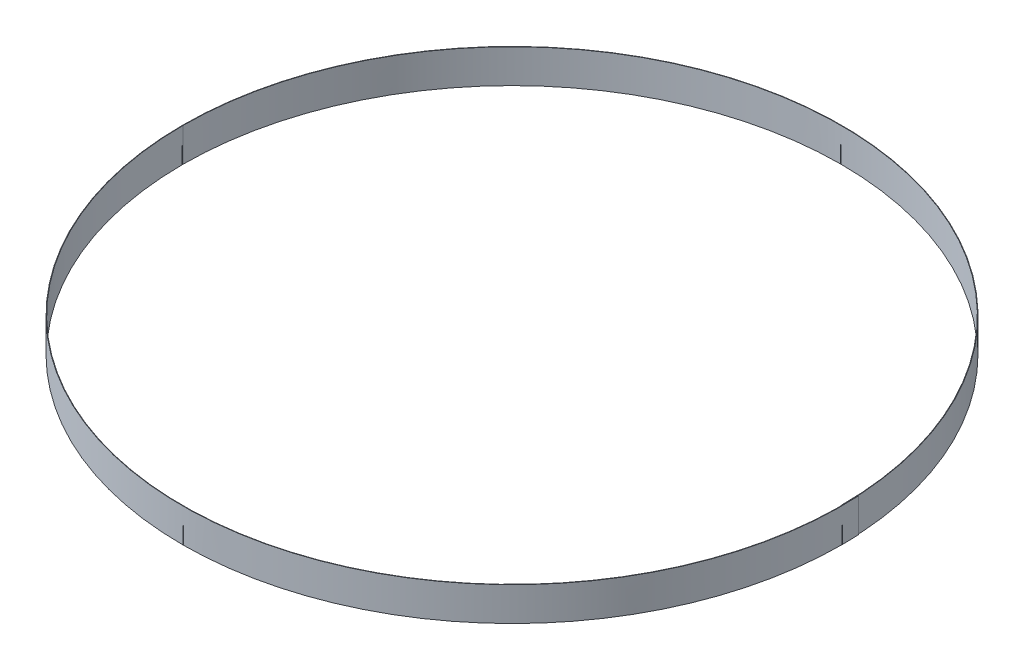
ISO-10303-21;
HEADER;
FILE_DESCRIPTION(('STEP AP214'),'2;1');
FILE_NAME('part.step','',(''),(''),'','','');
FILE_SCHEMA(('AUTOMOTIVE_DESIGN { 1 0 10303 214 1 1 1 1 }'));
ENDSEC;
DATA;
#1=APPLICATION_CONTEXT('core data for automotive mechanical design processes');
#2=APPLICATION_PROTOCOL_DEFINITION('international standard','automotive_design',2000,#1);
#3=PRODUCT_CONTEXT('',#1,'mechanical');
#4=PRODUCT('Part','Part','',(#3));
#5=PRODUCT_RELATED_PRODUCT_CATEGORY('part','',(#4));
#6=PRODUCT_DEFINITION_FORMATION('','',#4);
#7=PRODUCT_DEFINITION_CONTEXT('part definition',#1,'design');
#8=PRODUCT_DEFINITION('design','',#6,#7);
#9=PRODUCT_DEFINITION_SHAPE('','',#8);
#10=(LENGTH_UNIT() NAMED_UNIT(*) SI_UNIT(.MILLI.,.METRE.));
#11=(NAMED_UNIT(*) PLANE_ANGLE_UNIT() SI_UNIT($,.RADIAN.));
#12=(NAMED_UNIT(*) SI_UNIT($,.STERADIAN.) SOLID_ANGLE_UNIT());
#13=UNCERTAINTY_MEASURE_WITH_UNIT(LENGTH_MEASURE(1.E-05),#10,'distance_accuracy_value','');
#14=(GEOMETRIC_REPRESENTATION_CONTEXT(3) GLOBAL_UNCERTAINTY_ASSIGNED_CONTEXT((#13)) GLOBAL_UNIT_ASSIGNED_CONTEXT((#10,
#11,#12)) REPRESENTATION_CONTEXT('',''));
#15=CARTESIAN_POINT('',(0.,0.,0.));
#16=DIRECTION('',(0.,0.,1.));
#17=DIRECTION('',(1.,0.,0.));
#18=AXIS2_PLACEMENT_3D('',#15,#16,#17);
#19=CARTESIAN_POINT('',(195.5,15.,0.));
#20=DIRECTION('',(0.,0.,-1.));
#21=DIRECTION('',(0.,1.,0.));
#22=AXIS2_PLACEMENT_3D('',#19,#20,#21);
#23=PLANE('',#22);
#24=DIRECTION('',(-1.,0.,0.));
#25=VECTOR('',#24,1.);
#26=CARTESIAN_POINT('',(195.5,10.,0.));
#27=LINE('',#26,#25);
#28=CARTESIAN_POINT('',(195.75,10.,0.));
#29=VERTEX_POINT('',#28);
#30=CARTESIAN_POINT('',(195.5,10.,0.));
#31=VERTEX_POINT('',#30);
#32=EDGE_CURVE('E111',#29,#31,#27,.T.);
#33=ORIENTED_EDGE('',*,*,#32,.F.);
#34=DIRECTION('',(0.,-1.,0.));
#35=VECTOR('',#34,1.);
#36=CARTESIAN_POINT('',(195.75,629.899456202727,0.));
#37=LINE('',#36,#35);
#38=CARTESIAN_POINT('',(195.75,20.,0.));
#39=VERTEX_POINT('',#38);
#40=EDGE_CURVE('E310',#29,#39,#37,.F.);
#41=ORIENTED_EDGE('',*,*,#40,.T.);
#42=DIRECTION('',(-1.,0.,0.));
#43=VECTOR('',#42,1.);
#44=CARTESIAN_POINT('',(195.5,20.,0.));
#45=LINE('',#44,#43);
#46=CARTESIAN_POINT('',(195.5,20.,0.));
#47=VERTEX_POINT('',#46);
#48=EDGE_CURVE('E61',#39,#47,#45,.T.);
#49=ORIENTED_EDGE('',*,*,#48,.T.);
#50=DIRECTION('',(0.,1.,0.));
#51=VECTOR('',#50,1.);
#52=CARTESIAN_POINT('',(195.5,10.,0.));
#53=LINE('',#52,#51);
#54=EDGE_CURVE('E260',#31,#47,#53,.T.);
#55=ORIENTED_EDGE('',*,*,#54,.F.);
#56=EDGE_LOOP('',(#33,#41,#49,#55));
#57=FACE_BOUND('',#56,.T.);
#58=ADVANCED_FACE('F42',(#57),#23,.F.);
#59=CARTESIAN_POINT('',(0.,10.,0.));
#60=DIRECTION('',(0.,1.,0.));
#61=DIRECTION('',(0.,0.,1.));
#62=AXIS2_PLACEMENT_3D('',#59,#60,#61);
#63=PLANE('',#62);
#64=DIRECTION('',(-0.999998824118064,0.,0.00153354572478864));
#65=VECTOR('',#64,1.);
#66=CARTESIAN_POINT('',(195.499770115081,10.,-0.299808189196199));
#67=LINE('',#66,#65);
#68=CARTESIAN_POINT('',(195.749769821111,10.,-0.300191575627417));
#69=VERTEX_POINT('',#68);
#70=CARTESIAN_POINT('',(195.499770115081,10.,-0.299808189196199));
#71=VERTEX_POINT('',#70);
#72=EDGE_CURVE('E301',#69,#71,#67,.T.);
#73=ORIENTED_EDGE('',*,*,#72,.F.);
#74=CARTESIAN_POINT('',(0.,10.,0.));
#75=DIRECTION('',(0.,-1.,0.));
#76=DIRECTION('',(0.,0.,-1.));
#77=AXIS2_PLACEMENT_3D('',#74,#75,#76);
#78=CIRCLE('',#77,195.75);
#79=EDGE_CURVE('E307',#69,#29,#78,.T.);
#80=ORIENTED_EDGE('',*,*,#79,.T.);
#81=ORIENTED_EDGE('',*,*,#32,.T.);
#82=CARTESIAN_POINT('',(0.,10.,0.));
#83=DIRECTION('',(0.,-1.,0.));
#84=DIRECTION('',(0.,0.,-1.));
#85=AXIS2_PLACEMENT_3D('',#82,#83,#84);
#86=CIRCLE('',#85,195.5);
#87=EDGE_CURVE('E263',#71,#31,#86,.T.);
#88=ORIENTED_EDGE('',*,*,#87,.F.);
#89=EDGE_LOOP('',(#73,#80,#81,#88));
#90=FACE_BOUND('',#89,.T.);
#91=ADVANCED_FACE('F478',(#90),#63,.F.);
#92=CARTESIAN_POINT('',(195.499770115081,5.,-0.299808189196201));
#93=DIRECTION('',(-0.00153354572478865,0.,-0.999998824118064));
#94=DIRECTION('',(0.,1.,0.));
#95=AXIS2_PLACEMENT_3D('',#92,#93,#94);
#96=PLANE('',#95);
#97=DIRECTION('',(-0.999998824118064,0.,0.00153354572478919));
#98=VECTOR('',#97,1.);
#99=CARTESIAN_POINT('',(195.499770115081,0.,-0.299808189196307));
#100=LINE('',#99,#98);
#101=CARTESIAN_POINT('',(195.749769821111,0.,-0.300191575627417));
#102=VERTEX_POINT('',#101);
#103=CARTESIAN_POINT('',(195.499770115081,0.,-0.299808189196307));
#104=VERTEX_POINT('',#103);
#105=EDGE_CURVE('E296',#102,#104,#100,.T.);
#106=ORIENTED_EDGE('',*,*,#105,.F.);
#107=DIRECTION('',(0.,-1.,0.));
#108=VECTOR('',#107,1.);
#109=CARTESIAN_POINT('',(195.749769821111,629.899456202727,-0.300191575627417));
#110=LINE('',#109,#108);
#111=EDGE_CURVE('E303',#102,#69,#110,.F.);
#112=ORIENTED_EDGE('',*,*,#111,.T.);
#113=ORIENTED_EDGE('',*,*,#72,.T.);
#114=DIRECTION('',(0.,1.,0.));
#115=VECTOR('',#114,1.);
#116=CARTESIAN_POINT('',(195.499770115081,0.,-0.299808189196203));
#117=LINE('',#116,#115);
#118=EDGE_CURVE('E266',#104,#71,#117,.T.);
#119=ORIENTED_EDGE('',*,*,#118,.F.);
#120=EDGE_LOOP('',(#106,#112,#113,#119));
#121=FACE_BOUND('',#120,.T.);
#122=ADVANCED_FACE('F483',(#121),#96,.F.);
#123=CARTESIAN_POINT('',(0.,0.,0.));
#124=DIRECTION('',(0.,1.,0.));
#125=DIRECTION('',(0.,0.,1.));
#126=AXIS2_PLACEMENT_3D('',#123,#124,#125);
#127=PLANE('',#126);
#128=DIRECTION('',(0.00052942397909441,0.,0.999999859855115));
#129=VECTOR('',#128,1.);
#130=CARTESIAN_POINT('',(-0.103502387912957,0.,-195.499972601675));
#131=LINE('',#130,#129);
#132=CARTESIAN_POINT('',(-0.103634743907704,0.,-195.749972566639));
#133=VERTEX_POINT('',#132);
#134=CARTESIAN_POINT('',(-0.103502387912957,0.,-195.499972601675));
#135=VERTEX_POINT('',#134);
#136=EDGE_CURVE('E291',#133,#135,#131,.T.);
#137=ORIENTED_EDGE('',*,*,#136,.F.);
#138=CARTESIAN_POINT('',(0.,0.,0.));
#139=DIRECTION('',(0.,-1.,0.));
#140=DIRECTION('',(0.,0.,-1.));
#141=AXIS2_PLACEMENT_3D('',#138,#139,#140);
#142=CIRCLE('',#141,195.75);
#143=EDGE_CURVE('E298',#133,#102,#142,.T.);
#144=ORIENTED_EDGE('',*,*,#143,.T.);
#145=ORIENTED_EDGE('',*,*,#105,.T.);
#146=CARTESIAN_POINT('',(0.,0.,0.));
#147=DIRECTION('',(0.,-1.,0.));
#148=DIRECTION('',(0.,0.,-1.));
#149=AXIS2_PLACEMENT_3D('',#146,#147,#148);
#150=CIRCLE('',#149,195.5);
#151=EDGE_CURVE('E269',#135,#104,#150,.T.);
#152=ORIENTED_EDGE('',*,*,#151,.F.);
#153=EDGE_LOOP('',(#137,#144,#145,#152));
#154=FACE_BOUND('',#153,.T.);
#155=ADVANCED_FACE('F490',(#154),#127,.F.);
#156=CARTESIAN_POINT('',(-0.103502387912957,5.,-195.499972601675));
#157=DIRECTION('',(0.999999859855115,0.,-0.00052942397909441));
#158=DIRECTION('',(0.,-1.,0.));
#159=AXIS2_PLACEMENT_3D('',#156,#157,#158);
#160=PLANE('',#159);
#161=DIRECTION('',(0.00052942397909441,0.,0.999999859855115));
#162=VECTOR('',#161,1.);
#163=CARTESIAN_POINT('',(-0.103502387912957,10.,-195.499972601675));
#164=LINE('',#163,#162);
#165=CARTESIAN_POINT('',(-0.103634743907704,10.,-195.749972566639));
#166=VERTEX_POINT('',#165);
#167=CARTESIAN_POINT('',(-0.103502387912957,10.,-195.499972601675));
#168=VERTEX_POINT('',#167);
#169=EDGE_CURVE('E286',#166,#168,#164,.T.);
#170=ORIENTED_EDGE('',*,*,#169,.F.);
#171=DIRECTION('',(0.,-1.,0.));
#172=VECTOR('',#171,1.);
#173=CARTESIAN_POINT('',(-0.103634743907704,629.899456202727,-195.749972566639));
#174=LINE('',#173,#172);
#175=EDGE_CURVE('E293',#166,#133,#174,.T.);
#176=ORIENTED_EDGE('',*,*,#175,.T.);
#177=ORIENTED_EDGE('',*,*,#136,.T.);
#178=DIRECTION('',(0.,-1.,0.));
#179=VECTOR('',#178,1.);
#180=CARTESIAN_POINT('',(-0.103502387912957,10.,-195.499972601675));
#181=LINE('',#180,#179);
#182=EDGE_CURVE('E272',#168,#135,#181,.T.);
#183=ORIENTED_EDGE('',*,*,#182,.F.);
#184=EDGE_LOOP('',(#170,#176,#177,#183));
#185=FACE_BOUND('',#184,.T.);
#186=ADVANCED_FACE('F494',(#185),#160,.F.);
#187=CARTESIAN_POINT('',(0.,10.,0.));
#188=DIRECTION('',(0.,1.,0.));
#189=DIRECTION('',(0.,0.,1.));
#190=AXIS2_PLACEMENT_3D('',#187,#188,#189);
#191=PLANE('',#190);
#192=CARTESIAN_POINT('',(0.,10.,0.));
#193=DIRECTION('',(0.,-1.,0.));
#194=DIRECTION('',(0.,0.,-1.));
#195=AXIS2_PLACEMENT_3D('',#192,#193,#194);
#196=CIRCLE('',#195,195.75);
#197=CARTESIAN_POINT('',(-0.40382615560264,10.,-195.749583459164));
#198=VERTEX_POINT('',#197);
#199=EDGE_CURVE('E288',#198,#166,#196,.T.);
#200=ORIENTED_EDGE('',*,*,#199,.T.);
#201=ORIENTED_EDGE('',*,*,#169,.T.);
#202=CARTESIAN_POINT('',(0.,10.,0.));
#203=DIRECTION('',(0.,-1.,0.));
#204=DIRECTION('',(0.,0.,-1.));
#205=AXIS2_PLACEMENT_3D('',#202,#203,#204);
#206=CIRCLE('',#205,195.5);
#207=CARTESIAN_POINT('',(-0.40331041338601,10.,-195.499583991144));
#208=VERTEX_POINT('',#207);
#209=EDGE_CURVE('E275',#208,#168,#206,.T.);
#210=ORIENTED_EDGE('',*,*,#209,.F.);
#211=DIRECTION('',(0.0020629688664246,0.,0.999997872077464));
#212=VECTOR('',#211,1.);
#213=CARTESIAN_POINT('',(-0.40331041338601,10.,-195.499583991144));
#214=LINE('',#213,#212);
#215=EDGE_CURVE('E281',#198,#208,#214,.T.);
#216=ORIENTED_EDGE('',*,*,#215,.F.);
#217=EDGE_LOOP('',(#200,#201,#210,#216));
#218=FACE_BOUND('',#217,.T.);
#219=ADVANCED_FACE('F498',(#218),#191,.F.);
#220=CARTESIAN_POINT('',(-0.40331041338601,5.,-195.499583991144));
#221=DIRECTION('',(-0.999997872077464,0.,0.0020629688664246));
#222=DIRECTION('',(0.,1.,0.));
#223=AXIS2_PLACEMENT_3D('',#220,#221,#222);
#224=PLANE('',#223);
#225=DIRECTION('',(0.00206296886642472,0.,0.999997872077464));
#226=VECTOR('',#225,1.);
#227=CARTESIAN_POINT('',(-0.403310413386034,0.,-195.499583991144));
#228=LINE('',#227,#226);
#229=CARTESIAN_POINT('',(-0.40382615560264,0.,-195.749583459164));
#230=VERTEX_POINT('',#229);
#231=CARTESIAN_POINT('',(-0.403310413386034,0.,-195.499583991144));
#232=VERTEX_POINT('',#231);
#233=EDGE_CURVE('E243',#230,#232,#228,.T.);
#234=ORIENTED_EDGE('',*,*,#233,.F.);
#235=DIRECTION('',(0.,-1.,0.));
#236=VECTOR('',#235,1.);
#237=CARTESIAN_POINT('',(-0.40382615560264,629.899456202727,-195.749583459164));
#238=LINE('',#237,#236);
#239=EDGE_CURVE('E283',#230,#198,#238,.F.);
#240=ORIENTED_EDGE('',*,*,#239,.T.);
#241=ORIENTED_EDGE('',*,*,#215,.T.);
#242=DIRECTION('',(0.,1.,0.));
#243=VECTOR('',#242,1.);
#244=CARTESIAN_POINT('',(-0.40331041338601,0.,-195.499583991144));
#245=LINE('',#244,#243);
#246=EDGE_CURVE('E278',#232,#208,#245,.T.);
#247=ORIENTED_EDGE('',*,*,#246,.F.);
#248=EDGE_LOOP('',(#234,#240,#241,#247));
#249=FACE_BOUND('',#248,.T.);
#250=ADVANCED_FACE('F502',(#249),#224,.F.);
#251=CARTESIAN_POINT('',(0.,629.899456202727,0.));
#252=DIRECTION('',(0.,-1.,0.));
#253=DIRECTION('',(0.,0.,-1.));
#254=AXIS2_PLACEMENT_3D('',#251,#252,#253);
#255=CYLINDRICAL_SURFACE('',#254,195.5);
#256=ORIENTED_EDGE('',*,*,#246,.T.);
#257=ORIENTED_EDGE('',*,*,#209,.T.);
#258=ORIENTED_EDGE('',*,*,#182,.T.);
#259=ORIENTED_EDGE('',*,*,#151,.T.);
#260=ORIENTED_EDGE('',*,*,#118,.T.);
#261=ORIENTED_EDGE('',*,*,#87,.T.);
#262=ORIENTED_EDGE('',*,*,#54,.T.);
#263=CARTESIAN_POINT('',(0.,20.,0.));
#264=DIRECTION('',(0.,1.,0.));
#265=DIRECTION('',(0.,0.,1.));
#266=AXIS2_PLACEMENT_3D('',#263,#264,#265);
#267=CIRCLE('',#266,195.5);
#268=CARTESIAN_POINT('',(-195.5,20.,1.33188619175765E-12));
#269=VERTEX_POINT('',#268);
#270=EDGE_CURVE('E257',#47,#269,#267,.T.);
#271=ORIENTED_EDGE('',*,*,#270,.T.);
#272=DIRECTION('',(0.,-1.,0.));
#273=VECTOR('',#272,1.);
#274=CARTESIAN_POINT('',(-195.5,20.,-2.99760216648792E-12));
#275=LINE('',#274,#273);
#276=CARTESIAN_POINT('',(-195.5,0.,-1.51624929592019E-12));
#277=VERTEX_POINT('',#276);
#278=EDGE_CURVE('E254',#269,#277,#275,.T.);
#279=ORIENTED_EDGE('',*,*,#278,.T.);
#280=CARTESIAN_POINT('',(0.,0.,0.));
#281=DIRECTION('',(0.,-1.,0.));
#282=DIRECTION('',(0.,0.,-1.));
#283=AXIS2_PLACEMENT_3D('',#280,#281,#282);
#284=CIRCLE('',#283,195.5);
#285=EDGE_CURVE('E251',#277,#232,#284,.T.);
#286=ORIENTED_EDGE('',*,*,#285,.T.);
#287=EDGE_LOOP('',(#256,#257,#258,#259,#260,#261,#262,#271,#279,#286));
#288=FACE_BOUND('',#287,.T.);
#289=ADVANCED_FACE('F339',(#288),#255,.F.);
#290=CARTESIAN_POINT('',(0.,0.,0.));
#291=DIRECTION('',(0.,1.,0.));
#292=DIRECTION('',(0.,0.,1.));
#293=AXIS2_PLACEMENT_3D('',#290,#291,#292);
#294=PLANE('',#293);
#295=DIRECTION('',(-1.,0.,-1.75138387043877E-13));
#296=VECTOR('',#295,1.);
#297=CARTESIAN_POINT('',(-195.5,0.,-2.99760216648792E-12));
#298=LINE('',#297,#296);
#299=CARTESIAN_POINT('',(-195.75,0.,-3.10862446895044E-12));
#300=VERTEX_POINT('',#299);
#301=EDGE_CURVE('E248',#277,#300,#298,.T.);
#302=ORIENTED_EDGE('',*,*,#301,.T.);
#303=CARTESIAN_POINT('',(0.,0.,0.));
#304=DIRECTION('',(0.,-1.,0.));
#305=DIRECTION('',(0.,0.,-1.));
#306=AXIS2_PLACEMENT_3D('',#303,#304,#305);
#307=CIRCLE('',#306,195.75);
#308=EDGE_CURVE('E245',#300,#230,#307,.T.);
#309=ORIENTED_EDGE('',*,*,#308,.T.);
#310=ORIENTED_EDGE('',*,*,#233,.T.);
#311=ORIENTED_EDGE('',*,*,#285,.F.);
#312=EDGE_LOOP('',(#302,#309,#310,#311));
#313=FACE_BOUND('',#312,.T.);
#314=ADVANCED_FACE('F323',(#313),#294,.F.);
#315=CARTESIAN_POINT('',(0.,629.899456202727,0.));
#316=DIRECTION('',(0.,-1.,0.));
#317=DIRECTION('',(0.,0.,-1.));
#318=AXIS2_PLACEMENT_3D('',#315,#316,#317);
#319=CYLINDRICAL_SURFACE('',#318,195.75);
#320=ORIENTED_EDGE('',*,*,#239,.F.);
#321=ORIENTED_EDGE('',*,*,#308,.F.);
#322=DIRECTION('',(0.,-1.,0.));
#323=VECTOR('',#322,1.);
#324=CARTESIAN_POINT('',(-195.75,20.,-3.10862446895044E-12));
#325=LINE('',#324,#323);
#326=CARTESIAN_POINT('',(-195.75,20.,-1.22649684092107E-13));
#327=VERTEX_POINT('',#326);
#328=EDGE_CURVE('E46',#327,#300,#325,.T.);
#329=ORIENTED_EDGE('',*,*,#328,.F.);
#330=CARTESIAN_POINT('',(0.,20.,0.));
#331=DIRECTION('',(0.,-1.,0.));
#332=DIRECTION('',(0.,0.,-1.));
#333=AXIS2_PLACEMENT_3D('',#330,#331,#332);
#334=CIRCLE('',#333,195.75);
#335=EDGE_CURVE('E52',#39,#327,#334,.F.);
#336=ORIENTED_EDGE('',*,*,#335,.F.);
#337=ORIENTED_EDGE('',*,*,#40,.F.);
#338=ORIENTED_EDGE('',*,*,#79,.F.);
#339=ORIENTED_EDGE('',*,*,#111,.F.);
#340=ORIENTED_EDGE('',*,*,#143,.F.);
#341=ORIENTED_EDGE('',*,*,#175,.F.);
#342=ORIENTED_EDGE('',*,*,#199,.F.);
#343=EDGE_LOOP('',(#320,#321,#329,#336,#337,#338,#339,#340,#341,#342));
#344=FACE_BOUND('',#343,.T.);
#345=ADVANCED_FACE('F319',(#344),#319,.T.);
#346=CARTESIAN_POINT('',(0.,20.,0.));
#347=DIRECTION('',(0.,-1.,0.));
#348=DIRECTION('',(0.,0.,-1.));
#349=AXIS2_PLACEMENT_3D('',#346,#347,#348);
#350=PLANE('',#349);
#351=ORIENTED_EDGE('',*,*,#48,.F.);
#352=ORIENTED_EDGE('',*,*,#335,.T.);
#353=DIRECTION('',(1.,0.,1.75138387043877E-13));
#354=VECTOR('',#353,1.);
#355=CARTESIAN_POINT('',(-195.75,20.,-3.10862446895044E-12));
#356=LINE('',#355,#354);
#357=EDGE_CURVE('E11',#327,#269,#356,.T.);
#358=ORIENTED_EDGE('',*,*,#357,.T.);
#359=ORIENTED_EDGE('',*,*,#270,.F.);
#360=EDGE_LOOP('',(#351,#352,#358,#359));
#361=FACE_BOUND('',#360,.T.);
#362=ADVANCED_FACE('F44',(#361),#350,.F.);
#363=CARTESIAN_POINT('',(-195.499890476784,5.,0.207004831546077));
#364=DIRECTION('',(-0.0010581703328762,0.,-0.999999440137617));
#365=DIRECTION('',(0.,-1.,0.));
#366=AXIS2_PLACEMENT_3D('',#363,#364,#365);
#367=PLANE('',#366);
#368=DIRECTION('',(0.999999440137617,0.,-0.0010581703328762));
#369=VECTOR('',#368,1.);
#370=CARTESIAN_POINT('',(-195.499890476784,10.,0.207004831546077));
#371=LINE('',#370,#369);
#372=CARTESIAN_POINT('',(-195.749890336818,10.,0.207269374129356));
#373=VERTEX_POINT('',#372);
#374=CARTESIAN_POINT('',(-195.499890476784,10.,0.207004831546077));
#375=VERTEX_POINT('',#374);
#376=EDGE_CURVE('E178',#373,#375,#371,.T.);
#377=ORIENTED_EDGE('',*,*,#376,.F.);
#378=DIRECTION('',(0.,-1.,0.));
#379=VECTOR('',#378,1.);
#380=CARTESIAN_POINT('',(-195.749890336818,635.311089282251,0.207269374129356));
#381=LINE('',#380,#379);
#382=CARTESIAN_POINT('',(-195.749890336818,0.,0.207269374129356));
#383=VERTEX_POINT('',#382);
#384=EDGE_CURVE('E182',#373,#383,#381,.T.);
#385=ORIENTED_EDGE('',*,*,#384,.T.);
#386=DIRECTION('',(0.999999440137617,0.,-0.0010581703328762));
#387=VECTOR('',#386,1.);
#388=CARTESIAN_POINT('',(-195.499890476784,0.,0.207004831546077));
#389=LINE('',#388,#387);
#390=CARTESIAN_POINT('',(-195.499890476784,0.,0.207004831546077));
#391=VERTEX_POINT('',#390);
#392=EDGE_CURVE('E190',#383,#391,#389,.T.);
#393=ORIENTED_EDGE('',*,*,#392,.T.);
#394=DIRECTION('',(0.,-1.,0.));
#395=VECTOR('',#394,1.);
#396=CARTESIAN_POINT('',(-195.499890476784,10.,0.207004831546077));
#397=LINE('',#396,#395);
#398=EDGE_CURVE('E185',#375,#391,#397,.T.);
#399=ORIENTED_EDGE('',*,*,#398,.F.);
#400=EDGE_LOOP('',(#377,#385,#393,#399));
#401=FACE_BOUND('',#400,.T.);
#402=ADVANCED_FACE('F180',(#401),#367,.F.);
#403=CARTESIAN_POINT('',(0.125245877345664,0.,-2.94218604449392E-12));
#404=DIRECTION('',(0.,1.,0.));
#405=DIRECTION('',(0.,0.,1.));
#406=AXIS2_PLACEMENT_3D('',#403,#404,#405);
#407=PLANE('',#406);
#408=ORIENTED_EDGE('',*,*,#392,.F.);
#409=CARTESIAN_POINT('',(0.125245877345664,0.,-2.94218604449392E-12));
#410=DIRECTION('',(0.,-1.,0.));
#411=DIRECTION('',(0.,0.,-1.));
#412=AXIS2_PLACEMENT_3D('',#409,#410,#411);
#413=CIRCLE('',#412,195.875245877346);
#414=EDGE_CURVE('E119',#383,#300,#413,.T.);
#415=ORIENTED_EDGE('',*,*,#414,.T.);
#416=ORIENTED_EDGE('',*,*,#301,.F.);
#417=CARTESIAN_POINT('',(0.125245877345664,0.,-2.94218604449392E-12));
#418=DIRECTION('',(0.,-1.,0.));
#419=DIRECTION('',(0.,0.,-1.));
#420=AXIS2_PLACEMENT_3D('',#417,#418,#419);
#421=CIRCLE('',#420,195.625245877346);
#422=EDGE_CURVE('E201',#391,#277,#421,.T.);
#423=ORIENTED_EDGE('',*,*,#422,.F.);
#424=EDGE_LOOP('',(#408,#415,#416,#423));
#425=FACE_BOUND('',#424,.T.);
#426=ADVANCED_FACE('F327',(#425),#407,.F.);
#427=CARTESIAN_POINT('',(0.125245877345664,20.,-2.94218604449392E-12));
#428=DIRECTION('',(0.,-1.,0.));
#429=DIRECTION('',(0.,0.,-1.));
#430=AXIS2_PLACEMENT_3D('',#427,#428,#429);
#431=PLANE('',#430);
#432=ORIENTED_EDGE('',*,*,#357,.F.);
#433=CARTESIAN_POINT('',(0.125245877345664,20.,-2.94218604449392E-12));
#434=DIRECTION('',(0.,-1.,0.));
#435=DIRECTION('',(0.,0.,-1.));
#436=AXIS2_PLACEMENT_3D('',#433,#434,#435);
#437=CIRCLE('',#436,195.875245877346);
#438=CARTESIAN_POINT('',(195.743750330308,20.,-10.0256003858716));
#439=VERTEX_POINT('',#438);
#440=EDGE_CURVE('E316',#327,#439,#437,.F.);
#441=ORIENTED_EDGE('',*,*,#440,.T.);
#442=DIRECTION('',(-0.998689260487032,0.,0.0511836007708018));
#443=VECTOR('',#442,1.);
#444=CARTESIAN_POINT('',(195.494078015186,20.,-10.0128044856789));
#445=LINE('',#444,#443);
#446=CARTESIAN_POINT('',(195.494078015186,20.,-10.0128044856789));
#447=VERTEX_POINT('',#446);
#448=EDGE_CURVE('E236',#439,#447,#445,.T.);
#449=ORIENTED_EDGE('',*,*,#448,.T.);
#450=CARTESIAN_POINT('',(0.125245877345664,20.,-2.94218604449392E-12));
#451=DIRECTION('',(0.,1.,0.));
#452=DIRECTION('',(0.,0.,1.));
#453=AXIS2_PLACEMENT_3D('',#450,#451,#452);
#454=CIRCLE('',#453,195.625245877346);
#455=EDGE_CURVE('E336',#269,#447,#454,.T.);
#456=ORIENTED_EDGE('',*,*,#455,.F.);
#457=EDGE_LOOP('',(#432,#441,#449,#456));
#458=FACE_BOUND('',#457,.T.);
#459=ADVANCED_FACE('F344',(#458),#431,.F.);
#460=CARTESIAN_POINT('',(195.494078015186,10.,-10.0128044856789));
#461=DIRECTION('',(0.0511836007708016,0.,0.998689260487032));
#462=DIRECTION('',(0.,-1.,0.));
#463=AXIS2_PLACEMENT_3D('',#460,#461,#462);
#464=PLANE('',#463);
#465=ORIENTED_EDGE('',*,*,#448,.F.);
#466=DIRECTION('',(0.,-1.,0.));
#467=VECTOR('',#466,1.);
#468=CARTESIAN_POINT('',(195.743750330308,635.311089282251,-10.0256003858716));
#469=LINE('',#468,#467);
#470=CARTESIAN_POINT('',(195.743750330308,0.,-10.0256003858716));
#471=VERTEX_POINT('',#470);
#472=EDGE_CURVE('E407',#439,#471,#469,.T.);
#473=ORIENTED_EDGE('',*,*,#472,.T.);
#474=DIRECTION('',(-0.998689260487032,0.,0.0511836007708016));
#475=VECTOR('',#474,1.);
#476=CARTESIAN_POINT('',(195.494078015186,0.,-10.0128044856789));
#477=LINE('',#476,#475);
#478=CARTESIAN_POINT('',(195.494078015186,0.,-10.0128044856789));
#479=VERTEX_POINT('',#478);
#480=EDGE_CURVE('E233',#471,#479,#477,.T.);
#481=ORIENTED_EDGE('',*,*,#480,.T.);
#482=DIRECTION('',(0.,-1.,0.));
#483=VECTOR('',#482,1.);
#484=CARTESIAN_POINT('',(195.494078015186,20.,-10.0128044856789));
#485=LINE('',#484,#483);
#486=EDGE_CURVE('E347',#447,#479,#485,.T.);
#487=ORIENTED_EDGE('',*,*,#486,.F.);
#488=EDGE_LOOP('',(#465,#473,#481,#487));
#489=FACE_BOUND('',#488,.T.);
#490=ADVANCED_FACE('F411',(#489),#464,.F.);
#491=CARTESIAN_POINT('',(0.125245877345664,0.,-2.94218604449392E-12));
#492=DIRECTION('',(0.,1.,0.));
#493=DIRECTION('',(0.,0.,1.));
#494=AXIS2_PLACEMENT_3D('',#491,#492,#493);
#495=PLANE('',#494);
#496=ORIENTED_EDGE('',*,*,#480,.F.);
#497=CARTESIAN_POINT('',(0.125245877345664,0.,-2.94218604449392E-12));
#498=DIRECTION('',(0.,-1.,0.));
#499=DIRECTION('',(0.,0.,-1.));
#500=AXIS2_PLACEMENT_3D('',#497,#498,#499);
#501=CIRCLE('',#500,195.875245877346);
#502=CARTESIAN_POINT('',(196.000228715169,0.,-0.321007465769835));
#503=VERTEX_POINT('',#502);
#504=EDGE_CURVE('E404',#471,#503,#501,.T.);
#505=ORIENTED_EDGE('',*,*,#504,.T.);
#506=DIRECTION('',(-0.999998657106868,0.,0.00163883631302703));
#507=VECTOR('',#506,1.);
#508=CARTESIAN_POINT('',(195.750229050892,0.,-0.320597756691579));
#509=LINE('',#508,#507);
#510=CARTESIAN_POINT('',(195.750229050892,0.,-0.320597756691579));
#511=VERTEX_POINT('',#510);
#512=EDGE_CURVE('E230',#503,#511,#509,.T.);
#513=ORIENTED_EDGE('',*,*,#512,.T.);
#514=CARTESIAN_POINT('',(0.125245877345664,0.,-2.94218604449392E-12));
#515=DIRECTION('',(0.,-1.,0.));
#516=DIRECTION('',(0.,0.,-1.));
#517=AXIS2_PLACEMENT_3D('',#514,#515,#516);
#518=CIRCLE('',#517,195.625245877346);
#519=EDGE_CURVE('E349',#479,#511,#518,.T.);
#520=ORIENTED_EDGE('',*,*,#519,.F.);
#521=EDGE_LOOP('',(#496,#505,#513,#520));
#522=FACE_BOUND('',#521,.T.);
#523=ADVANCED_FACE('F417',(#522),#495,.F.);
#524=CARTESIAN_POINT('',(195.750229050892,5.,-0.320597756691564));
#525=DIRECTION('',(-0.00163883631302696,0.,-0.999998657106868));
#526=DIRECTION('',(0.,1.,0.));
#527=AXIS2_PLACEMENT_3D('',#524,#525,#526);
#528=PLANE('',#527);
#529=ORIENTED_EDGE('',*,*,#512,.F.);
#530=DIRECTION('',(0.,-1.,0.));
#531=VECTOR('',#530,1.);
#532=CARTESIAN_POINT('',(196.000228715169,635.311089282251,-0.321007465769835));
#533=LINE('',#532,#531);
#534=CARTESIAN_POINT('',(196.000228715169,10.,-0.321007465769835));
#535=VERTEX_POINT('',#534);
#536=EDGE_CURVE('E401',#503,#535,#533,.F.);
#537=ORIENTED_EDGE('',*,*,#536,.T.);
#538=DIRECTION('',(-0.999998657106868,0.,0.00163883631302696));
#539=VECTOR('',#538,1.);
#540=CARTESIAN_POINT('',(195.750229050892,10.,-0.320597756691564));
#541=LINE('',#540,#539);
#542=CARTESIAN_POINT('',(195.750229050892,10.,-0.320597756691564));
#543=VERTEX_POINT('',#542);
#544=EDGE_CURVE('E227',#535,#543,#541,.T.);
#545=ORIENTED_EDGE('',*,*,#544,.T.);
#546=DIRECTION('',(0.,1.,0.));
#547=VECTOR('',#546,1.);
#548=CARTESIAN_POINT('',(195.750229050892,0.,-0.320597756691564));
#549=LINE('',#548,#547);
#550=EDGE_CURVE('E354',#511,#543,#549,.T.);
#551=ORIENTED_EDGE('',*,*,#550,.F.);
#552=EDGE_LOOP('',(#529,#537,#545,#551));
#553=FACE_BOUND('',#552,.T.);
#554=ADVANCED_FACE('F426',(#553),#528,.F.);
#555=CARTESIAN_POINT('',(0.125245877345664,10.,-2.94218604449392E-12));
#556=DIRECTION('',(0.,1.,0.));
#557=DIRECTION('',(0.,0.,1.));
#558=AXIS2_PLACEMENT_3D('',#555,#556,#557);
#559=PLANE('',#558);
#560=ORIENTED_EDGE('',*,*,#544,.F.);
#561=CARTESIAN_POINT('',(0.125245877345664,10.,-2.94218604449392E-12));
#562=DIRECTION('',(0.,-1.,0.));
#563=DIRECTION('',(0.,0.,-1.));
#564=AXIS2_PLACEMENT_3D('',#561,#562,#563);
#565=CIRCLE('',#564,195.875245877346);
#566=CARTESIAN_POINT('',(196.000490648611,10.,-0.0208160387831023));
#567=VERTEX_POINT('',#566);
#568=EDGE_CURVE('E398',#535,#567,#565,.T.);
#569=ORIENTED_EDGE('',*,*,#568,.T.);
#570=DIRECTION('',(-0.999999994353139,0.,0.000106271921635237));
#571=VECTOR('',#570,1.);
#572=CARTESIAN_POINT('',(195.750490650023,10.,-0.0207894708026935));
#573=LINE('',#572,#571);
#574=CARTESIAN_POINT('',(195.750490650023,10.,-0.0207894708026935));
#575=VERTEX_POINT('',#574);
#576=EDGE_CURVE('E224',#567,#575,#573,.T.);
#577=ORIENTED_EDGE('',*,*,#576,.T.);
#578=CARTESIAN_POINT('',(0.125245877345664,10.,-2.94218604449392E-12));
#579=DIRECTION('',(0.,-1.,0.));
#580=DIRECTION('',(0.,0.,-1.));
#581=AXIS2_PLACEMENT_3D('',#578,#579,#580);
#582=CIRCLE('',#581,195.625245877346);
#583=EDGE_CURVE('E357',#543,#575,#582,.T.);
#584=ORIENTED_EDGE('',*,*,#583,.F.);
#585=EDGE_LOOP('',(#560,#569,#577,#584));
#586=FACE_BOUND('',#585,.T.);
#587=ADVANCED_FACE('F430',(#586),#559,.F.);
#588=CARTESIAN_POINT('',(195.750490650023,5.,-0.0207894708026792));
#589=DIRECTION('',(0.000106271921635164,0.,0.999999994353139));
#590=DIRECTION('',(0.,-1.,0.));
#591=AXIS2_PLACEMENT_3D('',#588,#589,#590);
#592=PLANE('',#591);
#593=ORIENTED_EDGE('',*,*,#576,.F.);
#594=DIRECTION('',(0.,-1.,0.));
#595=VECTOR('',#594,1.);
#596=CARTESIAN_POINT('',(196.000490648611,635.311089282251,-0.0208160387831023));
#597=LINE('',#596,#595);
#598=CARTESIAN_POINT('',(196.000490648611,0.,-0.0208160387831023));
#599=VERTEX_POINT('',#598);
#600=EDGE_CURVE('E395',#567,#599,#597,.T.);
#601=ORIENTED_EDGE('',*,*,#600,.T.);
#602=DIRECTION('',(-0.999999994353139,0.,0.000106271921635164));
#603=VECTOR('',#602,1.);
#604=CARTESIAN_POINT('',(195.750490650023,0.,-0.0207894708026792));
#605=LINE('',#604,#603);
#606=CARTESIAN_POINT('',(195.750490650023,0.,-0.0207894708026792));
#607=VERTEX_POINT('',#606);
#608=EDGE_CURVE('E221',#599,#607,#605,.T.);
#609=ORIENTED_EDGE('',*,*,#608,.T.);
#610=DIRECTION('',(0.,-1.,0.));
#611=VECTOR('',#610,1.);
#612=CARTESIAN_POINT('',(195.750490650023,10.,-0.0207894708026792));
#613=LINE('',#612,#611);
#614=EDGE_CURVE('E360',#575,#607,#613,.T.);
#615=ORIENTED_EDGE('',*,*,#614,.F.);
#616=EDGE_LOOP('',(#593,#601,#609,#615));
#617=FACE_BOUND('',#616,.T.);
#618=ADVANCED_FACE('F435',(#617),#592,.F.);
#619=CARTESIAN_POINT('',(0.125245877345664,0.,-2.94218604449392E-12));
#620=DIRECTION('',(0.,1.,0.));
#621=DIRECTION('',(0.,0.,1.));
#622=AXIS2_PLACEMENT_3D('',#619,#620,#621);
#623=PLANE('',#622);
#624=ORIENTED_EDGE('',*,*,#608,.F.);
#625=CARTESIAN_POINT('',(0.125245877345664,0.,-2.94218604449392E-12));
#626=DIRECTION('',(0.,-1.,0.));
#627=DIRECTION('',(0.,0.,-1.));
#628=AXIS2_PLACEMENT_3D('',#625,#626,#627);
#629=CIRCLE('',#628,195.875245877346);
#630=CARTESIAN_POINT('',(0.539479865037734,0.,195.874807868988));
#631=VERTEX_POINT('',#630);
#632=EDGE_CURVE('E392',#599,#631,#629,.T.);
#633=ORIENTED_EDGE('',*,*,#632,.T.);
#634=DIRECTION('',(-0.00211478477454705,0.,-0.999997763840178));
#635=VECTOR('',#634,1.);
#636=CARTESIAN_POINT('',(0.538951168844098,0.,195.624808428028));
#637=LINE('',#636,#635);
#638=CARTESIAN_POINT('',(0.538951168844098,0.,195.624808428028));
#639=VERTEX_POINT('',#638);
#640=EDGE_CURVE('E218',#631,#639,#637,.T.);
#641=ORIENTED_EDGE('',*,*,#640,.T.);
#642=CARTESIAN_POINT('',(0.125245877345664,0.,-2.94218604449392E-12));
#643=DIRECTION('',(0.,-1.,0.));
#644=DIRECTION('',(0.,0.,-1.));
#645=AXIS2_PLACEMENT_3D('',#642,#643,#644);
#646=CIRCLE('',#645,195.625245877346);
#647=EDGE_CURVE('E363',#607,#639,#646,.T.);
#648=ORIENTED_EDGE('',*,*,#647,.F.);
#649=EDGE_LOOP('',(#624,#633,#641,#648));
#650=FACE_BOUND('',#649,.T.);
#651=ADVANCED_FACE('F444',(#650),#623,.F.);
#652=CARTESIAN_POINT('',(0.538951168844084,5.,195.624808428028));
#653=DIRECTION('',(0.999997763840178,0.,-0.00211478477454698));
#654=DIRECTION('',(0.,1.,0.));
#655=AXIS2_PLACEMENT_3D('',#652,#653,#654);
#656=PLANE('',#655);
#657=ORIENTED_EDGE('',*,*,#640,.F.);
#658=DIRECTION('',(0.,-1.,0.));
#659=VECTOR('',#658,1.);
#660=CARTESIAN_POINT('',(0.539479865037734,635.311089282251,195.874807868988));
#661=LINE('',#660,#659);
#662=CARTESIAN_POINT('',(0.539479865037734,10.,195.874807868988));
#663=VERTEX_POINT('',#662);
#664=EDGE_CURVE('E389',#631,#663,#661,.F.);
#665=ORIENTED_EDGE('',*,*,#664,.T.);
#666=DIRECTION('',(-0.00211478477454698,0.,-0.999997763840178));
#667=VECTOR('',#666,1.);
#668=CARTESIAN_POINT('',(0.538951168844084,10.,195.624808428028));
#669=LINE('',#668,#667);
#670=CARTESIAN_POINT('',(0.538951168844084,10.,195.624808428028));
#671=VERTEX_POINT('',#670);
#672=EDGE_CURVE('E215',#663,#671,#669,.T.);
#673=ORIENTED_EDGE('',*,*,#672,.T.);
#674=DIRECTION('',(0.,1.,0.));
#675=VECTOR('',#674,1.);
#676=CARTESIAN_POINT('',(0.538951168844084,0.,195.624808428028));
#677=LINE('',#676,#675);
#678=EDGE_CURVE('E366',#639,#671,#677,.T.);
#679=ORIENTED_EDGE('',*,*,#678,.F.);
#680=EDGE_LOOP('',(#657,#665,#673,#679));
#681=FACE_BOUND('',#680,.T.);
#682=ADVANCED_FACE('F448',(#681),#656,.F.);
#683=CARTESIAN_POINT('',(0.125245877345664,10.,-2.94218604449392E-12));
#684=DIRECTION('',(0.,1.,0.));
#685=DIRECTION('',(0.,0.,1.));
#686=AXIS2_PLACEMENT_3D('',#683,#684,#685);
#687=PLANE('',#686);
#688=ORIENTED_EDGE('',*,*,#672,.F.);
#689=CARTESIAN_POINT('',(0.125245877345664,10.,-2.94218604449392E-12));
#690=DIRECTION('',(0.,-1.,0.));
#691=DIRECTION('',(0.,0.,-1.));
#692=AXIS2_PLACEMENT_3D('',#689,#690,#691);
#693=CIRCLE('',#692,195.875245877346);
#694=CARTESIAN_POINT('',(0.239288596718878,10.,195.875212678296));
#695=VERTEX_POINT('',#694);
#696=EDGE_CURVE('E386',#663,#695,#693,.T.);
#697=ORIENTED_EDGE('',*,*,#696,.T.);
#698=DIRECTION('',(-0.000582221193200828,0.,-0.999999830509227));
#699=VECTOR('',#698,1.);
#700=CARTESIAN_POINT('',(0.239143041420578,10.,195.625212720669));
#701=LINE('',#700,#699);
#702=CARTESIAN_POINT('',(0.239143041420578,10.,195.625212720669));
#703=VERTEX_POINT('',#702);
#704=EDGE_CURVE('E212',#695,#703,#701,.T.);
#705=ORIENTED_EDGE('',*,*,#704,.T.);
#706=CARTESIAN_POINT('',(0.125245877345664,10.,-2.94218604449392E-12));
#707=DIRECTION('',(0.,-1.,0.));
#708=DIRECTION('',(0.,0.,-1.));
#709=AXIS2_PLACEMENT_3D('',#706,#707,#708);
#710=CIRCLE('',#709,195.625245877346);
#711=EDGE_CURVE('E369',#671,#703,#710,.T.);
#712=ORIENTED_EDGE('',*,*,#711,.F.);
#713=EDGE_LOOP('',(#688,#697,#705,#712));
#714=FACE_BOUND('',#713,.T.);
#715=ADVANCED_FACE('F453',(#714),#687,.F.);
#716=CARTESIAN_POINT('',(0.239143041420558,5.,195.625212720669));
#717=DIRECTION('',(-0.999999830509227,0.,0.000582221193200725));
#718=DIRECTION('',(0.,-1.,0.));
#719=AXIS2_PLACEMENT_3D('',#716,#717,#718);
#720=PLANE('',#719);
#721=ORIENTED_EDGE('',*,*,#704,.F.);
#722=DIRECTION('',(0.,-1.,0.));
#723=VECTOR('',#722,1.);
#724=CARTESIAN_POINT('',(0.239288596718878,635.311089282251,195.875212678296));
#725=LINE('',#724,#723);
#726=CARTESIAN_POINT('',(0.239288596718878,0.,195.875212678296));
#727=VERTEX_POINT('',#726);
#728=EDGE_CURVE('E383',#695,#727,#725,.T.);
#729=ORIENTED_EDGE('',*,*,#728,.T.);
#730=DIRECTION('',(-0.000582221193200725,0.,-0.999999830509227));
#731=VECTOR('',#730,1.);
#732=CARTESIAN_POINT('',(0.239143041420558,0.,195.625212720669));
#733=LINE('',#732,#731);
#734=CARTESIAN_POINT('',(0.239143041420558,0.,195.625212720669));
#735=VERTEX_POINT('',#734);
#736=EDGE_CURVE('E209',#727,#735,#733,.T.);
#737=ORIENTED_EDGE('',*,*,#736,.T.);
#738=DIRECTION('',(0.,-1.,0.));
#739=VECTOR('',#738,1.);
#740=CARTESIAN_POINT('',(0.239143041420558,10.,195.625212720669));
#741=LINE('',#740,#739);
#742=EDGE_CURVE('E372',#703,#735,#741,.T.);
#743=ORIENTED_EDGE('',*,*,#742,.F.);
#744=EDGE_LOOP('',(#721,#729,#737,#743));
#745=FACE_BOUND('',#744,.T.);
#746=ADVANCED_FACE('F461',(#745),#720,.F.);
#747=CARTESIAN_POINT('',(0.125245877345664,0.,-2.94218604449392E-12));
#748=DIRECTION('',(0.,1.,0.));
#749=DIRECTION('',(0.,0.,1.));
#750=AXIS2_PLACEMENT_3D('',#747,#748,#749);
#751=PLANE('',#750);
#752=ORIENTED_EDGE('',*,*,#736,.F.);
#753=CARTESIAN_POINT('',(0.125245877345664,0.,-2.94218604449392E-12));
#754=DIRECTION('',(0.,-1.,0.));
#755=DIRECTION('',(0.,0.,-1.));
#756=AXIS2_PLACEMENT_3D('',#753,#754,#755);
#757=CIRCLE('',#756,195.875245877346);
#758=CARTESIAN_POINT('',(-195.749342651736,0.,0.507460415778686));
#759=VERTEX_POINT('',#758);
#760=EDGE_CURVE('E203',#727,#759,#757,.T.);
#761=ORIENTED_EDGE('',*,*,#760,.T.);
#762=DIRECTION('',(0.99999664404626,0.,-0.00259073275700899));
#763=VECTOR('',#762,1.);
#764=CARTESIAN_POINT('',(-195.499343490724,0.,0.506812732589434));
#765=LINE('',#764,#763);
#766=CARTESIAN_POINT('',(-195.499343490724,0.,0.506812732589434));
#767=VERTEX_POINT('',#766);
#768=EDGE_CURVE('E207',#759,#767,#765,.T.);
#769=ORIENTED_EDGE('',*,*,#768,.T.);
#770=CARTESIAN_POINT('',(0.125245877345664,0.,-2.94218604449392E-12));
#771=DIRECTION('',(0.,-1.,0.));
#772=DIRECTION('',(0.,0.,-1.));
#773=AXIS2_PLACEMENT_3D('',#770,#771,#772);
#774=CIRCLE('',#773,195.625245877346);
#775=EDGE_CURVE('E375',#735,#767,#774,.T.);
#776=ORIENTED_EDGE('',*,*,#775,.F.);
#777=EDGE_LOOP('',(#752,#761,#769,#776));
#778=FACE_BOUND('',#777,.T.);
#779=ADVANCED_FACE('F463',(#778),#751,.F.);
#780=CARTESIAN_POINT('',(-195.499343490724,5.,0.506812732589404));
#781=DIRECTION('',(0.00259073275700883,0.,0.99999664404626));
#782=DIRECTION('',(0.,1.,0.));
#783=AXIS2_PLACEMENT_3D('',#780,#781,#782);
#784=PLANE('',#783);
#785=ORIENTED_EDGE('',*,*,#768,.F.);
#786=DIRECTION('',(0.,-1.,0.));
#787=VECTOR('',#786,1.);
#788=CARTESIAN_POINT('',(-195.749342651736,635.311089282251,0.507460415778686));
#789=LINE('',#788,#787);
#790=CARTESIAN_POINT('',(-195.749342651736,10.,0.507460415778686));
#791=VERTEX_POINT('',#790);
#792=EDGE_CURVE('E199',#759,#791,#789,.F.);
#793=ORIENTED_EDGE('',*,*,#792,.T.);
#794=DIRECTION('',(0.99999664404626,0.,-0.00259073275700883));
#795=VECTOR('',#794,1.);
#796=CARTESIAN_POINT('',(-195.499343490724,10.,0.506812732589404));
#797=LINE('',#796,#795);
#798=CARTESIAN_POINT('',(-195.499343490724,10.,0.506812732589404));
#799=VERTEX_POINT('',#798);
#800=EDGE_CURVE('E128',#791,#799,#797,.T.);
#801=ORIENTED_EDGE('',*,*,#800,.T.);
#802=DIRECTION('',(0.,1.,0.));
#803=VECTOR('',#802,1.);
#804=CARTESIAN_POINT('',(-195.499343490724,0.,0.506812732589404));
#805=LINE('',#804,#803);
#806=EDGE_CURVE('E378',#767,#799,#805,.T.);
#807=ORIENTED_EDGE('',*,*,#806,.F.);
#808=EDGE_LOOP('',(#785,#793,#801,#807));
#809=FACE_BOUND('',#808,.T.);
#810=ADVANCED_FACE('F464',(#809),#784,.F.);
#811=CARTESIAN_POINT('',(0.125245877345664,10.,-2.94218604449392E-12));
#812=DIRECTION('',(0.,1.,0.));
#813=DIRECTION('',(0.,0.,1.));
#814=AXIS2_PLACEMENT_3D('',#811,#812,#813);
#815=PLANE('',#814);
#816=CARTESIAN_POINT('',(0.125245877345664,10.,-2.94218604449392E-12));
#817=DIRECTION('',(0.,-1.,0.));
#818=DIRECTION('',(0.,0.,-1.));
#819=AXIS2_PLACEMENT_3D('',#816,#817,#818);
#820=CIRCLE('',#819,195.875245877346);
#821=EDGE_CURVE('E196',#791,#373,#820,.T.);
#822=ORIENTED_EDGE('',*,*,#821,.T.);
#823=ORIENTED_EDGE('',*,*,#376,.T.);
#824=CARTESIAN_POINT('',(0.125245877345664,10.,-2.94218604449392E-12));
#825=DIRECTION('',(0.,-1.,0.));
#826=DIRECTION('',(0.,0.,-1.));
#827=AXIS2_PLACEMENT_3D('',#824,#825,#826);
#828=CIRCLE('',#827,195.625245877346);
#829=EDGE_CURVE('E240',#799,#375,#828,.T.);
#830=ORIENTED_EDGE('',*,*,#829,.F.);
#831=ORIENTED_EDGE('',*,*,#800,.F.);
#832=EDGE_LOOP('',(#822,#823,#830,#831));
#833=FACE_BOUND('',#832,.T.);
#834=ADVANCED_FACE('F198',(#833),#815,.F.);
#835=CARTESIAN_POINT('',(0.125245877345664,635.311089282251,-2.94218604449392E-12));
#836=DIRECTION('',(0.,-1.,0.));
#837=DIRECTION('',(0.,0.,-1.));
#838=AXIS2_PLACEMENT_3D('',#835,#836,#837);
#839=CYLINDRICAL_SURFACE('',#838,195.625245877346);
#840=ORIENTED_EDGE('',*,*,#806,.T.);
#841=ORIENTED_EDGE('',*,*,#829,.T.);
#842=ORIENTED_EDGE('',*,*,#398,.T.);
#843=ORIENTED_EDGE('',*,*,#422,.T.);
#844=ORIENTED_EDGE('',*,*,#278,.F.);
#845=ORIENTED_EDGE('',*,*,#455,.T.);
#846=ORIENTED_EDGE('',*,*,#486,.T.);
#847=ORIENTED_EDGE('',*,*,#519,.T.);
#848=ORIENTED_EDGE('',*,*,#550,.T.);
#849=ORIENTED_EDGE('',*,*,#583,.T.);
#850=ORIENTED_EDGE('',*,*,#614,.T.);
#851=ORIENTED_EDGE('',*,*,#647,.T.);
#852=ORIENTED_EDGE('',*,*,#678,.T.);
#853=ORIENTED_EDGE('',*,*,#711,.T.);
#854=ORIENTED_EDGE('',*,*,#742,.T.);
#855=ORIENTED_EDGE('',*,*,#775,.T.);
#856=EDGE_LOOP('',(#840,#841,#842,#843,#844,#845,#846,#847,#848,#849,#850,#851,#852,#853,#854,#855));
#857=FACE_BOUND('',#856,.T.);
#858=ADVANCED_FACE('F333',(#857),#839,.F.);
#859=CARTESIAN_POINT('',(0.125245877345664,635.311089282251,-2.94218604449392E-12));
#860=DIRECTION('',(0.,-1.,0.));
#861=DIRECTION('',(0.,0.,-1.));
#862=AXIS2_PLACEMENT_3D('',#859,#860,#861);
#863=CYLINDRICAL_SURFACE('',#862,195.875245877346);
#864=ORIENTED_EDGE('',*,*,#792,.F.);
#865=ORIENTED_EDGE('',*,*,#760,.F.);
#866=ORIENTED_EDGE('',*,*,#728,.F.);
#867=ORIENTED_EDGE('',*,*,#696,.F.);
#868=ORIENTED_EDGE('',*,*,#664,.F.);
#869=ORIENTED_EDGE('',*,*,#632,.F.);
#870=ORIENTED_EDGE('',*,*,#600,.F.);
#871=ORIENTED_EDGE('',*,*,#568,.F.);
#872=ORIENTED_EDGE('',*,*,#536,.F.);
#873=ORIENTED_EDGE('',*,*,#504,.F.);
#874=ORIENTED_EDGE('',*,*,#472,.F.);
#875=ORIENTED_EDGE('',*,*,#440,.F.);
#876=ORIENTED_EDGE('',*,*,#328,.T.);
#877=ORIENTED_EDGE('',*,*,#414,.F.);
#878=ORIENTED_EDGE('',*,*,#384,.F.);
#879=ORIENTED_EDGE('',*,*,#821,.F.);
#880=EDGE_LOOP('',(#864,#865,#866,#867,#868,#869,#870,#871,#872,#873,#874,#875,#876,#877,#878,#879));
#881=FACE_BOUND('',#880,.T.);
#882=ADVANCED_FACE('F195',(#881),#863,.T.);
#883=CLOSED_SHELL('',(#58,#91,#122,#155,#186,#219,#250,#289,#314,#345,#362,#402,#426,#459,#490,
#523,#554,#587,#618,#651,#682,#715,#746,#779,#810,#834,#858,#882));
#884=MANIFOLD_SOLID_BREP('B2',#883);
#885=ADVANCED_BREP_SHAPE_REPRESENTATION('',(#18,#884),#14);
#886=SHAPE_DEFINITION_REPRESENTATION(#9,#885);
ENDSEC;
END-ISO-10303-21;
